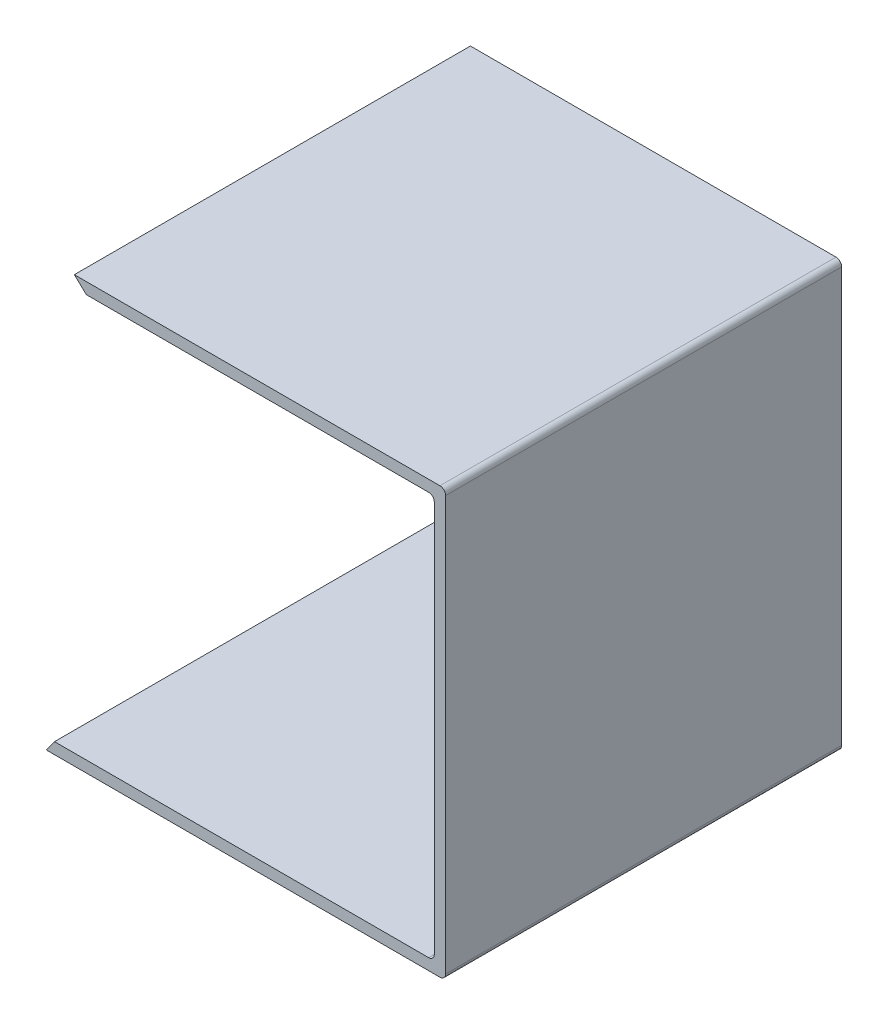
ISO-10303-21;
HEADER;
FILE_DESCRIPTION(('STEP AP214'),'2;1');
FILE_NAME('part.step','',(''),(''),'','','');
FILE_SCHEMA(('AUTOMOTIVE_DESIGN { 1 0 10303 214 1 1 1 1 }'));
ENDSEC;
DATA;
#1=APPLICATION_CONTEXT('core data for automotive mechanical design processes');
#2=APPLICATION_PROTOCOL_DEFINITION('international standard','automotive_design',2000,#1);
#3=PRODUCT_CONTEXT('',#1,'mechanical');
#4=PRODUCT('Part','Part','',(#3));
#5=PRODUCT_RELATED_PRODUCT_CATEGORY('part','',(#4));
#6=PRODUCT_DEFINITION_FORMATION('','',#4);
#7=PRODUCT_DEFINITION_CONTEXT('part definition',#1,'design');
#8=PRODUCT_DEFINITION('design','',#6,#7);
#9=PRODUCT_DEFINITION_SHAPE('','',#8);
#10=(LENGTH_UNIT() NAMED_UNIT(*) SI_UNIT(.MILLI.,.METRE.));
#11=(NAMED_UNIT(*) PLANE_ANGLE_UNIT() SI_UNIT($,.RADIAN.));
#12=(NAMED_UNIT(*) SI_UNIT($,.STERADIAN.) SOLID_ANGLE_UNIT());
#13=UNCERTAINTY_MEASURE_WITH_UNIT(LENGTH_MEASURE(1.E-05),#10,'distance_accuracy_value','');
#14=(GEOMETRIC_REPRESENTATION_CONTEXT(3) GLOBAL_UNCERTAINTY_ASSIGNED_CONTEXT((#13)) GLOBAL_UNIT_ASSIGNED_CONTEXT((#10,
#11,#12)) REPRESENTATION_CONTEXT('',''));
#15=CARTESIAN_POINT('',(0.,0.,0.));
#16=DIRECTION('',(0.,0.,1.));
#17=DIRECTION('',(1.,0.,0.));
#18=AXIS2_PLACEMENT_3D('',#15,#16,#17);
#19=CARTESIAN_POINT('',(139.13,0.,140.));
#20=DIRECTION('',(0.,1.,0.));
#21=DIRECTION('',(-1.,0.,0.));
#22=AXIS2_PLACEMENT_3D('',#19,#20,#21);
#23=PLANE('',#22);
#24=DIRECTION('',(1.,0.,0.));
#25=VECTOR('',#24,1.);
#26=CARTESIAN_POINT('',(139.13,0.,0.));
#27=LINE('',#26,#25);
#28=CARTESIAN_POINT('',(0.,0.,0.));
#29=VERTEX_POINT('',#28);
#30=CARTESIAN_POINT('',(139.13,0.,0.));
#31=VERTEX_POINT('',#30);
#32=EDGE_CURVE('E157',#29,#31,#27,.T.);
#33=ORIENTED_EDGE('',*,*,#32,.T.);
#34=DIRECTION('',(0.,0.,-1.));
#35=VECTOR('',#34,1.);
#36=CARTESIAN_POINT('',(139.13,0.,140.));
#37=LINE('',#36,#35);
#38=CARTESIAN_POINT('',(139.13,0.,140.));
#39=VERTEX_POINT('',#38);
#40=EDGE_CURVE('E11',#39,#31,#37,.T.);
#41=ORIENTED_EDGE('',*,*,#40,.F.);
#42=DIRECTION('',(1.,0.,0.));
#43=VECTOR('',#42,1.);
#44=CARTESIAN_POINT('',(139.13,0.,140.));
#45=LINE('',#44,#43);
#46=CARTESIAN_POINT('',(0.,0.,140.));
#47=VERTEX_POINT('',#46);
#48=EDGE_CURVE('E182',#47,#39,#45,.T.);
#49=ORIENTED_EDGE('',*,*,#48,.F.);
#50=DIRECTION('',(0.,0.,-1.));
#51=VECTOR('',#50,1.);
#52=CARTESIAN_POINT('',(0.,0.,140.));
#53=LINE('',#52,#51);
#54=EDGE_CURVE('E154',#47,#29,#53,.T.);
#55=ORIENTED_EDGE('',*,*,#54,.T.);
#56=EDGE_LOOP('',(#33,#41,#49,#55));
#57=FACE_BOUND('',#56,.T.);
#58=ADVANCED_FACE('F39',(#57),#23,.F.);
#59=CARTESIAN_POINT('',(139.13,2.,140.));
#60=DIRECTION('',(0.,0.,-1.));
#61=DIRECTION('',(-1.,0.,0.));
#62=AXIS2_PLACEMENT_3D('',#59,#60,#61);
#63=CYLINDRICAL_SURFACE('',#62,2.);
#64=CARTESIAN_POINT('',(139.13,2.,0.));
#65=DIRECTION('',(0.,0.,1.));
#66=DIRECTION('',(-1.,0.,0.));
#67=AXIS2_PLACEMENT_3D('',#64,#65,#66);
#68=CIRCLE('',#67,2.);
#69=CARTESIAN_POINT('',(141.13,2.,0.));
#70=VERTEX_POINT('',#69);
#71=EDGE_CURVE('E165',#31,#70,#68,.T.);
#72=ORIENTED_EDGE('',*,*,#71,.T.);
#73=DIRECTION('',(0.,0.,-1.));
#74=VECTOR('',#73,1.);
#75=CARTESIAN_POINT('',(141.13,2.,140.));
#76=LINE('',#75,#74);
#77=CARTESIAN_POINT('',(141.13,2.,140.));
#78=VERTEX_POINT('',#77);
#79=EDGE_CURVE('E50',#78,#70,#76,.T.);
#80=ORIENTED_EDGE('',*,*,#79,.F.);
#81=CARTESIAN_POINT('',(139.13,2.,140.));
#82=DIRECTION('',(0.,0.,1.));
#83=DIRECTION('',(-1.,0.,0.));
#84=AXIS2_PLACEMENT_3D('',#81,#82,#83);
#85=CIRCLE('',#84,2.);
#86=EDGE_CURVE('E109',#39,#78,#85,.T.);
#87=ORIENTED_EDGE('',*,*,#86,.F.);
#88=ORIENTED_EDGE('',*,*,#40,.T.);
#89=EDGE_LOOP('',(#72,#80,#87,#88));
#90=FACE_BOUND('',#89,.T.);
#91=ADVANCED_FACE('F259',(#90),#63,.T.);
#92=CARTESIAN_POINT('',(141.13,148.45,140.));
#93=DIRECTION('',(-1.,0.,0.));
#94=DIRECTION('',(0.,-1.,0.));
#95=AXIS2_PLACEMENT_3D('',#92,#93,#94);
#96=PLANE('',#95);
#97=DIRECTION('',(0.,1.,0.));
#98=VECTOR('',#97,1.);
#99=CARTESIAN_POINT('',(141.13,148.45,0.));
#100=LINE('',#99,#98);
#101=CARTESIAN_POINT('',(141.13,148.45,0.));
#102=VERTEX_POINT('',#101);
#103=EDGE_CURVE('E163',#70,#102,#100,.T.);
#104=ORIENTED_EDGE('',*,*,#103,.T.);
#105=DIRECTION('',(0.,0.,-1.));
#106=VECTOR('',#105,1.);
#107=CARTESIAN_POINT('',(141.13,148.45,140.));
#108=LINE('',#107,#106);
#109=CARTESIAN_POINT('',(141.13,148.45,140.));
#110=VERTEX_POINT('',#109);
#111=EDGE_CURVE('E199',#110,#102,#108,.T.);
#112=ORIENTED_EDGE('',*,*,#111,.F.);
#113=DIRECTION('',(0.,1.,0.));
#114=VECTOR('',#113,1.);
#115=CARTESIAN_POINT('',(141.13,148.45,140.));
#116=LINE('',#115,#114);
#117=EDGE_CURVE('E208',#78,#110,#116,.T.);
#118=ORIENTED_EDGE('',*,*,#117,.F.);
#119=ORIENTED_EDGE('',*,*,#79,.T.);
#120=EDGE_LOOP('',(#104,#112,#118,#119));
#121=FACE_BOUND('',#120,.T.);
#122=ADVANCED_FACE('F206',(#121),#96,.F.);
#123=CARTESIAN_POINT('',(139.13,148.45,140.));
#124=DIRECTION('',(0.,0.,-1.));
#125=DIRECTION('',(-1.,0.,0.));
#126=AXIS2_PLACEMENT_3D('',#123,#124,#125);
#127=CYLINDRICAL_SURFACE('',#126,2.);
#128=CARTESIAN_POINT('',(139.13,148.45,0.));
#129=DIRECTION('',(0.,0.,1.));
#130=DIRECTION('',(-1.,0.,0.));
#131=AXIS2_PLACEMENT_3D('',#128,#129,#130);
#132=CIRCLE('',#131,2.);
#133=CARTESIAN_POINT('',(139.13,150.45,0.));
#134=VERTEX_POINT('',#133);
#135=EDGE_CURVE('E167',#102,#134,#132,.T.);
#136=ORIENTED_EDGE('',*,*,#135,.T.);
#137=DIRECTION('',(0.,0.,-1.));
#138=VECTOR('',#137,1.);
#139=CARTESIAN_POINT('',(139.13,150.45,140.));
#140=LINE('',#139,#138);
#141=CARTESIAN_POINT('',(139.13,150.45,140.));
#142=VERTEX_POINT('',#141);
#143=EDGE_CURVE('E197',#142,#134,#140,.T.);
#144=ORIENTED_EDGE('',*,*,#143,.F.);
#145=CARTESIAN_POINT('',(139.13,148.45,140.));
#146=DIRECTION('',(0.,0.,1.));
#147=DIRECTION('',(-1.,0.,0.));
#148=AXIS2_PLACEMENT_3D('',#145,#146,#147);
#149=CIRCLE('',#148,2.);
#150=EDGE_CURVE('E227',#110,#142,#149,.T.);
#151=ORIENTED_EDGE('',*,*,#150,.F.);
#152=ORIENTED_EDGE('',*,*,#111,.T.);
#153=EDGE_LOOP('',(#136,#144,#151,#152));
#154=FACE_BOUND('',#153,.T.);
#155=ADVANCED_FACE('F220',(#154),#127,.T.);
#156=CARTESIAN_POINT('',(139.13,150.45,140.));
#157=DIRECTION('',(0.,-1.,0.));
#158=DIRECTION('',(1.,0.,0.));
#159=AXIS2_PLACEMENT_3D('',#156,#157,#158);
#160=PLANE('',#159);
#161=DIRECTION('',(-1.,0.,0.));
#162=VECTOR('',#161,1.);
#163=CARTESIAN_POINT('',(139.13,150.45,0.));
#164=LINE('',#163,#162);
#165=CARTESIAN_POINT('',(9.8941989744257,150.45,0.));
#166=VERTEX_POINT('',#165);
#167=EDGE_CURVE('E169',#134,#166,#164,.T.);
#168=ORIENTED_EDGE('',*,*,#167,.T.);
#169=DIRECTION('',(0.,0.,-1.));
#170=VECTOR('',#169,1.);
#171=CARTESIAN_POINT('',(9.8941989744257,150.45,140.));
#172=LINE('',#171,#170);
#173=CARTESIAN_POINT('',(9.8941989744257,150.45,140.));
#174=VERTEX_POINT('',#173);
#175=EDGE_CURVE('E191',#174,#166,#172,.T.);
#176=ORIENTED_EDGE('',*,*,#175,.F.);
#177=DIRECTION('',(-1.,0.,0.));
#178=VECTOR('',#177,1.);
#179=CARTESIAN_POINT('',(139.13,150.45,140.));
#180=LINE('',#179,#178);
#181=EDGE_CURVE('E224',#142,#174,#180,.T.);
#182=ORIENTED_EDGE('',*,*,#181,.F.);
#183=ORIENTED_EDGE('',*,*,#143,.T.);
#184=EDGE_LOOP('',(#168,#176,#182,#183));
#185=FACE_BOUND('',#184,.T.);
#186=ADVANCED_FACE('F222',(#185),#160,.F.);
#187=CARTESIAN_POINT('',(14.13,146.45,140.));
#188=DIRECTION('',(0.686580098595761,0.727054171442703,0.));
#189=DIRECTION('',(-0.727054171442703,0.686580098595761,0.));
#190=AXIS2_PLACEMENT_3D('',#187,#188,#189);
#191=PLANE('',#190);
#192=DIRECTION('',(0.727054171442703,-0.686580098595761,0.));
#193=VECTOR('',#192,1.);
#194=CARTESIAN_POINT('',(14.13,146.45,0.));
#195=LINE('',#194,#193);
#196=CARTESIAN_POINT('',(14.13,146.45,0.));
#197=VERTEX_POINT('',#196);
#198=EDGE_CURVE('E168',#166,#197,#195,.T.);
#199=ORIENTED_EDGE('',*,*,#198,.T.);
#200=DIRECTION('',(0.,0.,-1.));
#201=VECTOR('',#200,1.);
#202=CARTESIAN_POINT('',(14.13,146.45,140.));
#203=LINE('',#202,#201);
#204=CARTESIAN_POINT('',(14.13,146.45,140.));
#205=VERTEX_POINT('',#204);
#206=EDGE_CURVE('E192',#205,#197,#203,.T.);
#207=ORIENTED_EDGE('',*,*,#206,.F.);
#208=DIRECTION('',(0.727054171442703,-0.686580098595761,0.));
#209=VECTOR('',#208,1.);
#210=CARTESIAN_POINT('',(14.13,146.45,140.));
#211=LINE('',#210,#209);
#212=EDGE_CURVE('E223',#174,#205,#211,.T.);
#213=ORIENTED_EDGE('',*,*,#212,.F.);
#214=ORIENTED_EDGE('',*,*,#175,.T.);
#215=EDGE_LOOP('',(#199,#207,#213,#214));
#216=FACE_BOUND('',#215,.T.);
#217=ADVANCED_FACE('F275',(#216),#191,.F.);
#218=CARTESIAN_POINT('',(135.13,146.45,140.));
#219=DIRECTION('',(0.,1.,0.));
#220=DIRECTION('',(0.,0.,1.));
#221=AXIS2_PLACEMENT_3D('',#218,#219,#220);
#222=PLANE('',#221);
#223=DIRECTION('',(1.,0.,0.));
#224=VECTOR('',#223,1.);
#225=CARTESIAN_POINT('',(135.13,146.45,0.));
#226=LINE('',#225,#224);
#227=CARTESIAN_POINT('',(135.13,146.45,0.));
#228=VERTEX_POINT('',#227);
#229=EDGE_CURVE('E175',#197,#228,#226,.T.);
#230=ORIENTED_EDGE('',*,*,#229,.T.);
#231=DIRECTION('',(0.,0.,-1.));
#232=VECTOR('',#231,1.);
#233=CARTESIAN_POINT('',(135.13,146.45,140.));
#234=LINE('',#233,#232);
#235=CARTESIAN_POINT('',(135.13,146.45,140.));
#236=VERTEX_POINT('',#235);
#237=EDGE_CURVE('E189',#236,#228,#234,.T.);
#238=ORIENTED_EDGE('',*,*,#237,.F.);
#239=DIRECTION('',(1.,0.,0.));
#240=VECTOR('',#239,1.);
#241=CARTESIAN_POINT('',(135.13,146.45,140.));
#242=LINE('',#241,#240);
#243=EDGE_CURVE('E229',#205,#236,#242,.T.);
#244=ORIENTED_EDGE('',*,*,#243,.F.);
#245=ORIENTED_EDGE('',*,*,#206,.T.);
#246=EDGE_LOOP('',(#230,#238,#244,#245));
#247=FACE_BOUND('',#246,.T.);
#248=ADVANCED_FACE('F274',(#247),#222,.F.);
#249=CARTESIAN_POINT('',(135.13,144.45,140.));
#250=DIRECTION('',(0.,0.,-1.));
#251=DIRECTION('',(-1.,0.,0.));
#252=AXIS2_PLACEMENT_3D('',#249,#250,#251);
#253=CYLINDRICAL_SURFACE('',#252,1.99999999999999);
#254=CARTESIAN_POINT('',(135.13,144.45,0.));
#255=DIRECTION('',(0.,0.,-1.));
#256=DIRECTION('',(1.,0.,0.));
#257=AXIS2_PLACEMENT_3D('',#254,#255,#256);
#258=CIRCLE('',#257,1.99999999999999);
#259=CARTESIAN_POINT('',(137.13,144.45,0.));
#260=VERTEX_POINT('',#259);
#261=EDGE_CURVE('E171',#228,#260,#258,.T.);
#262=ORIENTED_EDGE('',*,*,#261,.T.);
#263=DIRECTION('',(0.,0.,-1.));
#264=VECTOR('',#263,1.);
#265=CARTESIAN_POINT('',(137.13,144.45,140.));
#266=LINE('',#265,#264);
#267=CARTESIAN_POINT('',(137.13,144.45,140.));
#268=VERTEX_POINT('',#267);
#269=EDGE_CURVE('E183',#268,#260,#266,.T.);
#270=ORIENTED_EDGE('',*,*,#269,.F.);
#271=CARTESIAN_POINT('',(135.13,144.45,140.));
#272=DIRECTION('',(0.,0.,-1.));
#273=DIRECTION('',(1.,0.,0.));
#274=AXIS2_PLACEMENT_3D('',#271,#272,#273);
#275=CIRCLE('',#274,1.99999999999999);
#276=EDGE_CURVE('E231',#236,#268,#275,.T.);
#277=ORIENTED_EDGE('',*,*,#276,.F.);
#278=ORIENTED_EDGE('',*,*,#237,.T.);
#279=EDGE_LOOP('',(#262,#270,#277,#278));
#280=FACE_BOUND('',#279,.T.);
#281=ADVANCED_FACE('F238',(#280),#253,.F.);
#282=CARTESIAN_POINT('',(137.13,5.99999999999998,140.));
#283=DIRECTION('',(1.,0.,0.));
#284=DIRECTION('',(0.,1.,0.));
#285=AXIS2_PLACEMENT_3D('',#282,#283,#284);
#286=PLANE('',#285);
#287=DIRECTION('',(0.,-1.,0.));
#288=VECTOR('',#287,1.);
#289=CARTESIAN_POINT('',(137.13,5.99999999999998,0.));
#290=LINE('',#289,#288);
#291=CARTESIAN_POINT('',(137.13,5.99999999999998,0.));
#292=VERTEX_POINT('',#291);
#293=EDGE_CURVE('E177',#260,#292,#290,.T.);
#294=ORIENTED_EDGE('',*,*,#293,.T.);
#295=DIRECTION('',(0.,0.,-1.));
#296=VECTOR('',#295,1.);
#297=CARTESIAN_POINT('',(137.13,5.99999999999998,140.));
#298=LINE('',#297,#296);
#299=CARTESIAN_POINT('',(137.13,5.99999999999998,140.));
#300=VERTEX_POINT('',#299);
#301=EDGE_CURVE('E147',#300,#292,#298,.T.);
#302=ORIENTED_EDGE('',*,*,#301,.F.);
#303=DIRECTION('',(0.,-1.,0.));
#304=VECTOR('',#303,1.);
#305=CARTESIAN_POINT('',(137.13,5.99999999999998,140.));
#306=LINE('',#305,#304);
#307=EDGE_CURVE('E143',#268,#300,#306,.T.);
#308=ORIENTED_EDGE('',*,*,#307,.F.);
#309=ORIENTED_EDGE('',*,*,#269,.T.);
#310=EDGE_LOOP('',(#294,#302,#308,#309));
#311=FACE_BOUND('',#310,.T.);
#312=ADVANCED_FACE('F241',(#311),#286,.F.);
#313=CARTESIAN_POINT('',(135.13,5.99999999999998,140.));
#314=DIRECTION('',(0.,0.,-1.));
#315=DIRECTION('',(-1.,0.,0.));
#316=AXIS2_PLACEMENT_3D('',#313,#314,#315);
#317=CYLINDRICAL_SURFACE('',#316,1.99999999999999);
#318=CARTESIAN_POINT('',(135.13,5.99999999999998,0.));
#319=DIRECTION('',(0.,0.,-1.));
#320=DIRECTION('',(1.,0.,0.));
#321=AXIS2_PLACEMENT_3D('',#318,#319,#320);
#322=CIRCLE('',#321,1.99999999999999);
#323=CARTESIAN_POINT('',(135.13,3.99999999999998,0.));
#324=VERTEX_POINT('',#323);
#325=EDGE_CURVE('E149',#292,#324,#322,.T.);
#326=ORIENTED_EDGE('',*,*,#325,.T.);
#327=DIRECTION('',(0.,0.,-1.));
#328=VECTOR('',#327,1.);
#329=CARTESIAN_POINT('',(135.13,3.99999999999998,140.));
#330=LINE('',#329,#328);
#331=CARTESIAN_POINT('',(135.13,3.99999999999998,140.));
#332=VERTEX_POINT('',#331);
#333=EDGE_CURVE('E148',#332,#324,#330,.T.);
#334=ORIENTED_EDGE('',*,*,#333,.F.);
#335=CARTESIAN_POINT('',(135.13,5.99999999999998,140.));
#336=DIRECTION('',(0.,0.,-1.));
#337=DIRECTION('',(1.,0.,0.));
#338=AXIS2_PLACEMENT_3D('',#335,#336,#337);
#339=CIRCLE('',#338,1.99999999999999);
#340=EDGE_CURVE('E133',#300,#332,#339,.T.);
#341=ORIENTED_EDGE('',*,*,#340,.F.);
#342=ORIENTED_EDGE('',*,*,#301,.T.);
#343=EDGE_LOOP('',(#326,#334,#341,#342));
#344=FACE_BOUND('',#343,.T.);
#345=ADVANCED_FACE('F150',(#344),#317,.F.);
#346=CARTESIAN_POINT('',(2.89020069584163,4.,140.));
#347=DIRECTION('',(0.,-1.,0.));
#348=DIRECTION('',(1.,0.,0.));
#349=AXIS2_PLACEMENT_3D('',#346,#347,#348);
#350=PLANE('',#349);
#351=DIRECTION('',(-1.,0.,0.));
#352=VECTOR('',#351,1.);
#353=CARTESIAN_POINT('',(2.89020069584163,4.,0.));
#354=LINE('',#353,#352);
#355=CARTESIAN_POINT('',(2.89020069584163,4.,0.));
#356=VERTEX_POINT('',#355);
#357=EDGE_CURVE('E96',#324,#356,#354,.T.);
#358=ORIENTED_EDGE('',*,*,#357,.T.);
#359=DIRECTION('',(0.,0.,-1.));
#360=VECTOR('',#359,1.);
#361=CARTESIAN_POINT('',(2.89020069584163,4.,140.));
#362=LINE('',#361,#360);
#363=CARTESIAN_POINT('',(2.89020069584163,4.,140.));
#364=VERTEX_POINT('',#363);
#365=EDGE_CURVE('E151',#364,#356,#362,.T.);
#366=ORIENTED_EDGE('',*,*,#365,.F.);
#367=DIRECTION('',(-1.,0.,0.));
#368=VECTOR('',#367,1.);
#369=CARTESIAN_POINT('',(2.89020069584163,4.,140.));
#370=LINE('',#369,#368);
#371=EDGE_CURVE('E136',#332,#364,#370,.T.);
#372=ORIENTED_EDGE('',*,*,#371,.F.);
#373=ORIENTED_EDGE('',*,*,#333,.T.);
#374=EDGE_LOOP('',(#358,#366,#372,#373));
#375=FACE_BOUND('',#374,.T.);
#376=ADVANCED_FACE('F153',(#375),#350,.F.);
#377=CARTESIAN_POINT('',(0.,0.,140.));
#378=DIRECTION('',(0.810553038353258,-0.585665238866285,0.));
#379=DIRECTION('',(0.585665238866285,0.810553038353258,0.));
#380=AXIS2_PLACEMENT_3D('',#377,#378,#379);
#381=PLANE('',#380);
#382=DIRECTION('',(-0.585665238866285,-0.810553038353258,0.));
#383=VECTOR('',#382,1.);
#384=CARTESIAN_POINT('',(0.,0.,0.));
#385=LINE('',#384,#383);
#386=EDGE_CURVE('E105',#356,#29,#385,.T.);
#387=ORIENTED_EDGE('',*,*,#386,.T.);
#388=ORIENTED_EDGE('',*,*,#54,.F.);
#389=DIRECTION('',(-0.585665238866285,-0.810553038353258,0.));
#390=VECTOR('',#389,1.);
#391=CARTESIAN_POINT('',(0.,0.,140.));
#392=LINE('',#391,#390);
#393=EDGE_CURVE('E54',#364,#47,#392,.T.);
#394=ORIENTED_EDGE('',*,*,#393,.F.);
#395=ORIENTED_EDGE('',*,*,#365,.T.);
#396=EDGE_LOOP('',(#387,#388,#394,#395));
#397=FACE_BOUND('',#396,.T.);
#398=ADVANCED_FACE('F249',(#397),#381,.F.);
#399=CARTESIAN_POINT('',(135.13,5.99999999999998,140.));
#400=DIRECTION('',(0.,0.,1.));
#401=DIRECTION('',(1.,0.,0.));
#402=AXIS2_PLACEMENT_3D('',#399,#400,#401);
#403=PLANE('',#402);
#404=ORIENTED_EDGE('',*,*,#48,.T.);
#405=ORIENTED_EDGE('',*,*,#86,.T.);
#406=ORIENTED_EDGE('',*,*,#117,.T.);
#407=ORIENTED_EDGE('',*,*,#150,.T.);
#408=ORIENTED_EDGE('',*,*,#181,.T.);
#409=ORIENTED_EDGE('',*,*,#212,.T.);
#410=ORIENTED_EDGE('',*,*,#243,.T.);
#411=ORIENTED_EDGE('',*,*,#276,.T.);
#412=ORIENTED_EDGE('',*,*,#307,.T.);
#413=ORIENTED_EDGE('',*,*,#340,.T.);
#414=ORIENTED_EDGE('',*,*,#371,.T.);
#415=ORIENTED_EDGE('',*,*,#393,.T.);
#416=EDGE_LOOP('',(#404,#405,#406,#407,#408,#409,#410,#411,#412,#413,#414,#415));
#417=FACE_BOUND('',#416,.T.);
#418=ADVANCED_FACE('F140',(#417),#403,.T.);
#419=CARTESIAN_POINT('',(135.13,5.99999999999998,0.));
#420=DIRECTION('',(0.,0.,1.));
#421=DIRECTION('',(1.,0.,0.));
#422=AXIS2_PLACEMENT_3D('',#419,#420,#421);
#423=PLANE('',#422);
#424=ORIENTED_EDGE('',*,*,#32,.F.);
#425=ORIENTED_EDGE('',*,*,#386,.F.);
#426=ORIENTED_EDGE('',*,*,#357,.F.);
#427=ORIENTED_EDGE('',*,*,#325,.F.);
#428=ORIENTED_EDGE('',*,*,#293,.F.);
#429=ORIENTED_EDGE('',*,*,#261,.F.);
#430=ORIENTED_EDGE('',*,*,#229,.F.);
#431=ORIENTED_EDGE('',*,*,#198,.F.);
#432=ORIENTED_EDGE('',*,*,#167,.F.);
#433=ORIENTED_EDGE('',*,*,#135,.F.);
#434=ORIENTED_EDGE('',*,*,#103,.F.);
#435=ORIENTED_EDGE('',*,*,#71,.F.);
#436=EDGE_LOOP('',(#424,#425,#426,#427,#428,#429,#430,#431,#432,#433,#434,#435));
#437=FACE_BOUND('',#436,.T.);
#438=ADVANCED_FACE('F215',(#437),#423,.F.);
#439=CLOSED_SHELL('',(#58,#91,#122,#155,#186,#217,#248,#281,#312,#345,#376,#398,#418,#438));
#440=MANIFOLD_SOLID_BREP('B2',#439);
#441=ADVANCED_BREP_SHAPE_REPRESENTATION('',(#18,#440),#14);
#442=SHAPE_DEFINITION_REPRESENTATION(#9,#441);
ENDSEC;
END-ISO-10303-21;
